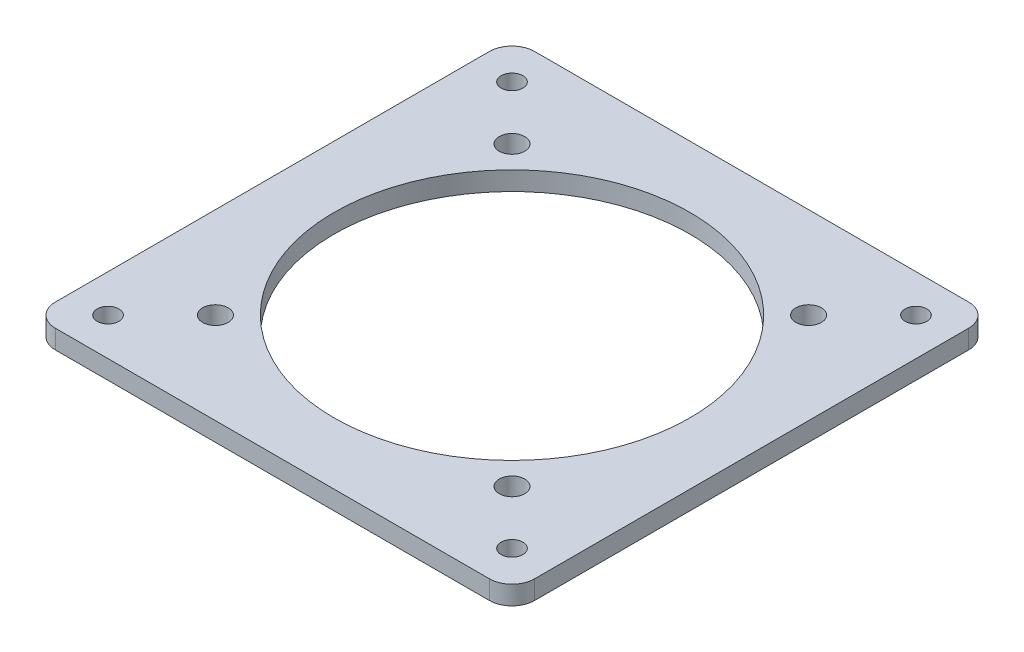
ISO-10303-21;
HEADER;
FILE_DESCRIPTION(('STEP AP214'),'2;1');
FILE_NAME('part.step','',(''),(''),'','','');
FILE_SCHEMA(('AUTOMOTIVE_DESIGN { 1 0 10303 214 1 1 1 1 }'));
ENDSEC;
DATA;
#1=APPLICATION_CONTEXT('core data for automotive mechanical design processes');
#2=APPLICATION_PROTOCOL_DEFINITION('international standard','automotive_design',2000,#1);
#3=PRODUCT_CONTEXT('',#1,'mechanical');
#4=PRODUCT('Part','Part','',(#3));
#5=PRODUCT_RELATED_PRODUCT_CATEGORY('part','',(#4));
#6=PRODUCT_DEFINITION_FORMATION('','',#4);
#7=PRODUCT_DEFINITION_CONTEXT('part definition',#1,'design');
#8=PRODUCT_DEFINITION('design','',#6,#7);
#9=PRODUCT_DEFINITION_SHAPE('','',#8);
#10=(LENGTH_UNIT() NAMED_UNIT(*) SI_UNIT(.MILLI.,.METRE.));
#11=(NAMED_UNIT(*) PLANE_ANGLE_UNIT() SI_UNIT($,.RADIAN.));
#12=(NAMED_UNIT(*) SI_UNIT($,.STERADIAN.) SOLID_ANGLE_UNIT());
#13=UNCERTAINTY_MEASURE_WITH_UNIT(LENGTH_MEASURE(1.E-05),#10,'distance_accuracy_value','');
#14=(GEOMETRIC_REPRESENTATION_CONTEXT(3) GLOBAL_UNCERTAINTY_ASSIGNED_CONTEXT((#13)) GLOBAL_UNIT_ASSIGNED_CONTEXT((#10,
#11,#12)) REPRESENTATION_CONTEXT('',''));
#15=CARTESIAN_POINT('',(0.,0.,0.));
#16=DIRECTION('',(0.,0.,1.));
#17=DIRECTION('',(1.,0.,0.));
#18=AXIS2_PLACEMENT_3D('',#15,#16,#17);
#19=CARTESIAN_POINT('',(36.59,3.175,36.5900000000002));
#20=DIRECTION('',(0.,1.,0.));
#21=DIRECTION('',(0.,0.,1.));
#22=AXIS2_PLACEMENT_3D('',#19,#20,#21);
#23=PLANE('',#22);
#24=CARTESIAN_POINT('',(-34.0499999999999,3.175,34.0499999999995));
#25=DIRECTION('',(0.,1.,0.));
#26=DIRECTION('',(0.,0.,1.));
#27=AXIS2_PLACEMENT_3D('',#24,#25,#26);
#28=CIRCLE('',#27,1.8288);
#29=CARTESIAN_POINT('',(-34.0499999999999,3.175,35.8787999999995));
#30=VERTEX_POINT('',#29);
#31=EDGE_CURVE('E220',#30,#30,#28,.T.);
#32=ORIENTED_EDGE('',*,*,#31,.F.);
#33=EDGE_LOOP('',(#32));
#34=FACE_BOUND('',#33,.T.);
#35=CARTESIAN_POINT('',(34.0500000000001,3.175,-34.0499999999997));
#36=DIRECTION('',(0.,1.,0.));
#37=DIRECTION('',(0.,0.,1.));
#38=AXIS2_PLACEMENT_3D('',#35,#36,#37);
#39=CIRCLE('',#38,1.82880000000001);
#40=CARTESIAN_POINT('',(34.0500000000001,3.175,-32.2211999999997));
#41=VERTEX_POINT('',#40);
#42=EDGE_CURVE('E208',#41,#41,#39,.T.);
#43=ORIENTED_EDGE('',*,*,#42,.F.);
#44=EDGE_LOOP('',(#43));
#45=FACE_BOUND('',#44,.T.);
#46=CARTESIAN_POINT('',(25.,3.175,25.0000000000009));
#47=DIRECTION('',(0.,1.,0.));
#48=DIRECTION('',(0.,0.,1.));
#49=AXIS2_PLACEMENT_3D('',#46,#47,#48);
#50=CIRCLE('',#49,2.15000000000019);
#51=CARTESIAN_POINT('',(25.,3.175,27.1500000000011));
#52=VERTEX_POINT('',#51);
#53=EDGE_CURVE('E196',#52,#52,#50,.T.);
#54=ORIENTED_EDGE('',*,*,#53,.F.);
#55=EDGE_LOOP('',(#54));
#56=FACE_BOUND('',#55,.T.);
#57=CARTESIAN_POINT('',(-25.,3.175,-25.000000000001));
#58=DIRECTION('',(0.,1.,0.));
#59=DIRECTION('',(0.,0.,1.));
#60=AXIS2_PLACEMENT_3D('',#57,#58,#59);
#61=CIRCLE('',#60,2.14999999999967);
#62=CARTESIAN_POINT('',(-25.,3.175,-22.8500000000013));
#63=VERTEX_POINT('',#62);
#64=EDGE_CURVE('E184',#63,#63,#61,.T.);
#65=ORIENTED_EDGE('',*,*,#64,.F.);
#66=EDGE_LOOP('',(#65));
#67=FACE_BOUND('',#66,.T.);
#68=CARTESIAN_POINT('',(36.59,3.175,36.5900000000002));
#69=DIRECTION('',(0.,1.,0.));
#70=DIRECTION('',(0.,0.,1.));
#71=AXIS2_PLACEMENT_3D('',#68,#69,#70);
#72=CIRCLE('',#71,3.80999999999992);
#73=CARTESIAN_POINT('',(36.59,3.175,40.4000000000001));
#74=VERTEX_POINT('',#73);
#75=CARTESIAN_POINT('',(40.4,3.175,36.5900000000002));
#76=VERTEX_POINT('',#75);
#77=EDGE_CURVE('E147',#74,#76,#72,.T.);
#78=ORIENTED_EDGE('',*,*,#77,.T.);
#79=DIRECTION('',(0.,0.,-1.));
#80=VECTOR('',#79,1.);
#81=CARTESIAN_POINT('',(40.4,3.175,-36.5900000000001));
#82=LINE('',#81,#80);
#83=CARTESIAN_POINT('',(40.4,3.175,-36.5900000000001));
#84=VERTEX_POINT('',#83);
#85=EDGE_CURVE('E95',#76,#84,#82,.T.);
#86=ORIENTED_EDGE('',*,*,#85,.T.);
#87=CARTESIAN_POINT('',(36.5900000000001,3.175,-36.5900000000001));
#88=DIRECTION('',(0.,1.,0.));
#89=DIRECTION('',(0.,0.,1.));
#90=AXIS2_PLACEMENT_3D('',#87,#88,#89);
#91=CIRCLE('',#90,3.80999999999993);
#92=CARTESIAN_POINT('',(36.5900000000001,3.175,-40.4));
#93=VERTEX_POINT('',#92);
#94=EDGE_CURVE('E162',#84,#93,#91,.T.);
#95=ORIENTED_EDGE('',*,*,#94,.T.);
#96=DIRECTION('',(-1.,0.,0.));
#97=VECTOR('',#96,1.);
#98=CARTESIAN_POINT('',(-36.5900000000002,3.175,-40.4));
#99=LINE('',#98,#97);
#100=CARTESIAN_POINT('',(-36.5900000000002,3.175,-40.4));
#101=VERTEX_POINT('',#100);
#102=EDGE_CURVE('E175',#93,#101,#99,.T.);
#103=ORIENTED_EDGE('',*,*,#102,.T.);
#104=CARTESIAN_POINT('',(-36.5900000000002,3.175,-36.5900000000001));
#105=DIRECTION('',(0.,1.,0.));
#106=DIRECTION('',(0.,0.,-1.));
#107=AXIS2_PLACEMENT_3D('',#104,#105,#106);
#108=CIRCLE('',#107,3.8099999999999);
#109=CARTESIAN_POINT('',(-40.4,3.175,-36.5900000000001));
#110=VERTEX_POINT('',#109);
#111=EDGE_CURVE('E114',#101,#110,#108,.T.);
#112=ORIENTED_EDGE('',*,*,#111,.T.);
#113=DIRECTION('',(0.,0.,1.));
#114=VECTOR('',#113,1.);
#115=CARTESIAN_POINT('',(-40.4,3.175,-36.5900000000001));
#116=LINE('',#115,#114);
#117=CARTESIAN_POINT('',(-40.4,3.175,36.5900000000001));
#118=VERTEX_POINT('',#117);
#119=EDGE_CURVE('E108',#110,#118,#116,.T.);
#120=ORIENTED_EDGE('',*,*,#119,.T.);
#121=CARTESIAN_POINT('',(-36.59,3.175,36.5900000000001));
#122=DIRECTION('',(0.,1.,0.));
#123=DIRECTION('',(0.,0.,-1.));
#124=AXIS2_PLACEMENT_3D('',#121,#122,#123);
#125=CIRCLE('',#124,3.81000000000004);
#126=CARTESIAN_POINT('',(-36.59,3.175,40.4000000000001));
#127=VERTEX_POINT('',#126);
#128=EDGE_CURVE('E112',#118,#127,#125,.T.);
#129=ORIENTED_EDGE('',*,*,#128,.T.);
#130=DIRECTION('',(1.,0.,0.));
#131=VECTOR('',#130,1.);
#132=CARTESIAN_POINT('',(-36.59,3.175,40.4000000000001));
#133=LINE('',#132,#131);
#134=EDGE_CURVE('E52',#127,#74,#133,.T.);
#135=ORIENTED_EDGE('',*,*,#134,.T.);
#136=EDGE_LOOP('',(#78,#86,#95,#103,#112,#120,#129,#135));
#137=FACE_BOUND('',#136,.T.);
#138=CARTESIAN_POINT('',(0.,3.175,0.));
#139=DIRECTION('',(0.,1.,0.));
#140=DIRECTION('',(0.,0.,1.));
#141=AXIS2_PLACEMENT_3D('',#138,#139,#140);
#142=CIRCLE('',#141,30.);
#143=CARTESIAN_POINT('',(0.,3.175,30.));
#144=VERTEX_POINT('',#143);
#145=EDGE_CURVE('E136',#144,#144,#142,.T.);
#146=ORIENTED_EDGE('',*,*,#145,.F.);
#147=EDGE_LOOP('',(#146));
#148=FACE_BOUND('',#147,.T.);
#149=CARTESIAN_POINT('',(25.,3.175,-25.0000000000009));
#150=DIRECTION('',(0.,1.,0.));
#151=DIRECTION('',(0.,0.,1.));
#152=AXIS2_PLACEMENT_3D('',#149,#150,#151);
#153=CIRCLE('',#152,2.14999999999969);
#154=CARTESIAN_POINT('',(25.,3.175,-22.8500000000012));
#155=VERTEX_POINT('',#154);
#156=EDGE_CURVE('E190',#155,#155,#153,.T.);
#157=ORIENTED_EDGE('',*,*,#156,.F.);
#158=EDGE_LOOP('',(#157));
#159=FACE_BOUND('',#158,.T.);
#160=CARTESIAN_POINT('',(-25.,3.175,25.0000000000009));
#161=DIRECTION('',(0.,1.,0.));
#162=DIRECTION('',(0.,0.,1.));
#163=AXIS2_PLACEMENT_3D('',#160,#161,#162);
#164=CIRCLE('',#163,2.15000000000013);
#165=CARTESIAN_POINT('',(-25.,3.175,27.150000000001));
#166=VERTEX_POINT('',#165);
#167=EDGE_CURVE('E202',#166,#166,#164,.T.);
#168=ORIENTED_EDGE('',*,*,#167,.F.);
#169=EDGE_LOOP('',(#168));
#170=FACE_BOUND('',#169,.T.);
#171=CARTESIAN_POINT('',(34.0500000000001,3.175,34.0499999999995));
#172=DIRECTION('',(0.,1.,0.));
#173=DIRECTION('',(0.,0.,1.));
#174=AXIS2_PLACEMENT_3D('',#171,#172,#173);
#175=CIRCLE('',#174,1.82880000000001);
#176=CARTESIAN_POINT('',(34.0500000000001,3.175,35.8787999999995));
#177=VERTEX_POINT('',#176);
#178=EDGE_CURVE('E214',#177,#177,#175,.T.);
#179=ORIENTED_EDGE('',*,*,#178,.F.);
#180=EDGE_LOOP('',(#179));
#181=FACE_BOUND('',#180,.T.);
#182=CARTESIAN_POINT('',(-34.0499999999999,3.175,-34.0499999999997));
#183=DIRECTION('',(0.,1.,0.));
#184=DIRECTION('',(0.,0.,1.));
#185=AXIS2_PLACEMENT_3D('',#182,#183,#184);
#186=CIRCLE('',#185,1.8288);
#187=CARTESIAN_POINT('',(-34.0499999999999,3.175,-32.2211999999997));
#188=VERTEX_POINT('',#187);
#189=EDGE_CURVE('E226',#188,#188,#186,.T.);
#190=ORIENTED_EDGE('',*,*,#189,.F.);
#191=EDGE_LOOP('',(#190));
#192=FACE_BOUND('',#191,.T.);
#193=ADVANCED_FACE('F35',(#34,#45,#56,#67,#137,#148,#159,#170,#181,#192),#23,.T.);
#194=CARTESIAN_POINT('',(36.59,0.,36.5900000000002));
#195=DIRECTION('',(0.,1.,0.));
#196=DIRECTION('',(0.,0.,1.));
#197=AXIS2_PLACEMENT_3D('',#194,#195,#196);
#198=PLANE('',#197);
#199=CARTESIAN_POINT('',(36.59,0.,36.5900000000002));
#200=DIRECTION('',(0.,1.,0.));
#201=DIRECTION('',(0.,0.,1.));
#202=AXIS2_PLACEMENT_3D('',#199,#200,#201);
#203=CIRCLE('',#202,3.80999999999992);
#204=CARTESIAN_POINT('',(36.59,0.,40.4000000000001));
#205=VERTEX_POINT('',#204);
#206=CARTESIAN_POINT('',(40.4,0.,36.5900000000002));
#207=VERTEX_POINT('',#206);
#208=EDGE_CURVE('E132',#205,#207,#203,.T.);
#209=ORIENTED_EDGE('',*,*,#208,.F.);
#210=DIRECTION('',(1.,0.,0.));
#211=VECTOR('',#210,1.);
#212=CARTESIAN_POINT('',(-36.59,0.,40.4000000000001));
#213=LINE('',#212,#211);
#214=CARTESIAN_POINT('',(-36.59,0.,40.4000000000001));
#215=VERTEX_POINT('',#214);
#216=EDGE_CURVE('E87',#215,#205,#213,.T.);
#217=ORIENTED_EDGE('',*,*,#216,.F.);
#218=CARTESIAN_POINT('',(-36.59,0.,36.5900000000001));
#219=DIRECTION('',(0.,1.,0.));
#220=DIRECTION('',(0.,0.,-1.));
#221=AXIS2_PLACEMENT_3D('',#218,#219,#220);
#222=CIRCLE('',#221,3.81000000000004);
#223=CARTESIAN_POINT('',(-40.4,0.,36.5900000000001));
#224=VERTEX_POINT('',#223);
#225=EDGE_CURVE('E81',#224,#215,#222,.T.);
#226=ORIENTED_EDGE('',*,*,#225,.F.);
#227=DIRECTION('',(0.,0.,1.));
#228=VECTOR('',#227,1.);
#229=CARTESIAN_POINT('',(-40.4,0.,-36.5900000000001));
#230=LINE('',#229,#228);
#231=CARTESIAN_POINT('',(-40.4,0.,-36.5900000000001));
#232=VERTEX_POINT('',#231);
#233=EDGE_CURVE('E122',#232,#224,#230,.T.);
#234=ORIENTED_EDGE('',*,*,#233,.F.);
#235=CARTESIAN_POINT('',(-36.5900000000002,0.,-36.5900000000001));
#236=DIRECTION('',(0.,1.,0.));
#237=DIRECTION('',(0.,0.,-1.));
#238=AXIS2_PLACEMENT_3D('',#235,#236,#237);
#239=CIRCLE('',#238,3.8099999999999);
#240=CARTESIAN_POINT('',(-36.5900000000002,0.,-40.4));
#241=VERTEX_POINT('',#240);
#242=EDGE_CURVE('E142',#241,#232,#239,.T.);
#243=ORIENTED_EDGE('',*,*,#242,.F.);
#244=DIRECTION('',(-1.,0.,0.));
#245=VECTOR('',#244,1.);
#246=CARTESIAN_POINT('',(-36.5900000000002,0.,-40.4));
#247=LINE('',#246,#245);
#248=CARTESIAN_POINT('',(36.5900000000001,0.,-40.4));
#249=VERTEX_POINT('',#248);
#250=EDGE_CURVE('E140',#249,#241,#247,.T.);
#251=ORIENTED_EDGE('',*,*,#250,.F.);
#252=CARTESIAN_POINT('',(36.5900000000001,0.,-36.5900000000001));
#253=DIRECTION('',(0.,1.,0.));
#254=DIRECTION('',(0.,0.,1.));
#255=AXIS2_PLACEMENT_3D('',#252,#253,#254);
#256=CIRCLE('',#255,3.80999999999993);
#257=CARTESIAN_POINT('',(40.4,0.,-36.5900000000001));
#258=VERTEX_POINT('',#257);
#259=EDGE_CURVE('E138',#258,#249,#256,.T.);
#260=ORIENTED_EDGE('',*,*,#259,.F.);
#261=DIRECTION('',(0.,0.,-1.));
#262=VECTOR('',#261,1.);
#263=CARTESIAN_POINT('',(40.4,0.,-36.5900000000001));
#264=LINE('',#263,#262);
#265=EDGE_CURVE('E135',#207,#258,#264,.T.);
#266=ORIENTED_EDGE('',*,*,#265,.F.);
#267=EDGE_LOOP('',(#209,#217,#226,#234,#243,#251,#260,#266));
#268=FACE_BOUND('',#267,.T.);
#269=CARTESIAN_POINT('',(0.,0.,0.));
#270=DIRECTION('',(0.,1.,0.));
#271=DIRECTION('',(0.,0.,1.));
#272=AXIS2_PLACEMENT_3D('',#269,#270,#271);
#273=CIRCLE('',#272,30.);
#274=CARTESIAN_POINT('',(0.,0.,30.));
#275=VERTEX_POINT('',#274);
#276=EDGE_CURVE('E181',#275,#275,#273,.T.);
#277=ORIENTED_EDGE('',*,*,#276,.T.);
#278=EDGE_LOOP('',(#277));
#279=FACE_BOUND('',#278,.T.);
#280=CARTESIAN_POINT('',(-25.,0.,-25.000000000001));
#281=DIRECTION('',(0.,1.,0.));
#282=DIRECTION('',(0.,0.,1.));
#283=AXIS2_PLACEMENT_3D('',#280,#281,#282);
#284=CIRCLE('',#283,2.14999999999967);
#285=CARTESIAN_POINT('',(-25.,0.,-22.8500000000013));
#286=VERTEX_POINT('',#285);
#287=EDGE_CURVE('E187',#286,#286,#284,.T.);
#288=ORIENTED_EDGE('',*,*,#287,.T.);
#289=EDGE_LOOP('',(#288));
#290=FACE_BOUND('',#289,.T.);
#291=CARTESIAN_POINT('',(25.,0.,-25.0000000000009));
#292=DIRECTION('',(0.,1.,0.));
#293=DIRECTION('',(0.,0.,1.));
#294=AXIS2_PLACEMENT_3D('',#291,#292,#293);
#295=CIRCLE('',#294,2.14999999999969);
#296=CARTESIAN_POINT('',(25.,0.,-22.8500000000012));
#297=VERTEX_POINT('',#296);
#298=EDGE_CURVE('E193',#297,#297,#295,.T.);
#299=ORIENTED_EDGE('',*,*,#298,.T.);
#300=EDGE_LOOP('',(#299));
#301=FACE_BOUND('',#300,.T.);
#302=CARTESIAN_POINT('',(25.,0.,25.0000000000009));
#303=DIRECTION('',(0.,1.,0.));
#304=DIRECTION('',(0.,0.,1.));
#305=AXIS2_PLACEMENT_3D('',#302,#303,#304);
#306=CIRCLE('',#305,2.15000000000019);
#307=CARTESIAN_POINT('',(25.,0.,27.1500000000011));
#308=VERTEX_POINT('',#307);
#309=EDGE_CURVE('E199',#308,#308,#306,.T.);
#310=ORIENTED_EDGE('',*,*,#309,.T.);
#311=EDGE_LOOP('',(#310));
#312=FACE_BOUND('',#311,.T.);
#313=CARTESIAN_POINT('',(-25.,0.,25.0000000000009));
#314=DIRECTION('',(0.,1.,0.));
#315=DIRECTION('',(0.,0.,1.));
#316=AXIS2_PLACEMENT_3D('',#313,#314,#315);
#317=CIRCLE('',#316,2.15000000000013);
#318=CARTESIAN_POINT('',(-25.,0.,27.150000000001));
#319=VERTEX_POINT('',#318);
#320=EDGE_CURVE('E205',#319,#319,#317,.T.);
#321=ORIENTED_EDGE('',*,*,#320,.T.);
#322=EDGE_LOOP('',(#321));
#323=FACE_BOUND('',#322,.T.);
#324=CARTESIAN_POINT('',(34.0500000000001,0.,-34.0499999999997));
#325=DIRECTION('',(0.,1.,0.));
#326=DIRECTION('',(0.,0.,1.));
#327=AXIS2_PLACEMENT_3D('',#324,#325,#326);
#328=CIRCLE('',#327,1.82880000000001);
#329=CARTESIAN_POINT('',(34.0500000000001,0.,-32.2211999999997));
#330=VERTEX_POINT('',#329);
#331=EDGE_CURVE('E211',#330,#330,#328,.T.);
#332=ORIENTED_EDGE('',*,*,#331,.T.);
#333=EDGE_LOOP('',(#332));
#334=FACE_BOUND('',#333,.T.);
#335=CARTESIAN_POINT('',(34.0500000000001,0.,34.0499999999995));
#336=DIRECTION('',(0.,1.,0.));
#337=DIRECTION('',(0.,0.,1.));
#338=AXIS2_PLACEMENT_3D('',#335,#336,#337);
#339=CIRCLE('',#338,1.82880000000001);
#340=CARTESIAN_POINT('',(34.0500000000001,0.,35.8787999999995));
#341=VERTEX_POINT('',#340);
#342=EDGE_CURVE('E217',#341,#341,#339,.T.);
#343=ORIENTED_EDGE('',*,*,#342,.T.);
#344=EDGE_LOOP('',(#343));
#345=FACE_BOUND('',#344,.T.);
#346=CARTESIAN_POINT('',(-34.0499999999999,0.,34.0499999999995));
#347=DIRECTION('',(0.,1.,0.));
#348=DIRECTION('',(0.,0.,1.));
#349=AXIS2_PLACEMENT_3D('',#346,#347,#348);
#350=CIRCLE('',#349,1.8288);
#351=CARTESIAN_POINT('',(-34.0499999999999,0.,35.8787999999995));
#352=VERTEX_POINT('',#351);
#353=EDGE_CURVE('E223',#352,#352,#350,.T.);
#354=ORIENTED_EDGE('',*,*,#353,.T.);
#355=EDGE_LOOP('',(#354));
#356=FACE_BOUND('',#355,.T.);
#357=CARTESIAN_POINT('',(-34.0499999999999,0.,-34.0499999999997));
#358=DIRECTION('',(0.,1.,0.));
#359=DIRECTION('',(0.,0.,1.));
#360=AXIS2_PLACEMENT_3D('',#357,#358,#359);
#361=CIRCLE('',#360,1.8288);
#362=CARTESIAN_POINT('',(-34.0499999999999,0.,-32.2211999999997));
#363=VERTEX_POINT('',#362);
#364=EDGE_CURVE('E229',#363,#363,#361,.T.);
#365=ORIENTED_EDGE('',*,*,#364,.T.);
#366=EDGE_LOOP('',(#365));
#367=FACE_BOUND('',#366,.T.);
#368=ADVANCED_FACE('F166',(#268,#279,#290,#301,#312,#323,#334,#345,#356,#367),#198,.F.);
#369=CARTESIAN_POINT('',(36.59,3.175,36.5900000000002));
#370=DIRECTION('',(0.,-1.,0.));
#371=DIRECTION('',(0.,0.,-1.));
#372=AXIS2_PLACEMENT_3D('',#369,#370,#371);
#373=CYLINDRICAL_SURFACE('',#372,3.80999999999992);
#374=ORIENTED_EDGE('',*,*,#208,.T.);
#375=DIRECTION('',(0.,-1.,0.));
#376=VECTOR('',#375,1.);
#377=CARTESIAN_POINT('',(40.4,3.175,36.5900000000002));
#378=LINE('',#377,#376);
#379=EDGE_CURVE('E11',#76,#207,#378,.T.);
#380=ORIENTED_EDGE('',*,*,#379,.F.);
#381=ORIENTED_EDGE('',*,*,#77,.F.);
#382=DIRECTION('',(0.,-1.,0.));
#383=VECTOR('',#382,1.);
#384=CARTESIAN_POINT('',(36.59,3.175,40.4000000000001));
#385=LINE('',#384,#383);
#386=EDGE_CURVE('E128',#74,#205,#385,.T.);
#387=ORIENTED_EDGE('',*,*,#386,.T.);
#388=EDGE_LOOP('',(#374,#380,#381,#387));
#389=FACE_BOUND('',#388,.T.);
#390=ADVANCED_FACE('F37',(#389),#373,.T.);
#391=CARTESIAN_POINT('',(40.4,3.175,-36.5900000000001));
#392=DIRECTION('',(-1.,0.,0.));
#393=DIRECTION('',(0.,0.,1.));
#394=AXIS2_PLACEMENT_3D('',#391,#392,#393);
#395=PLANE('',#394);
#396=ORIENTED_EDGE('',*,*,#265,.T.);
#397=DIRECTION('',(0.,-1.,0.));
#398=VECTOR('',#397,1.);
#399=CARTESIAN_POINT('',(40.4,3.175,-36.5900000000001));
#400=LINE('',#399,#398);
#401=EDGE_CURVE('E44',#84,#258,#400,.T.);
#402=ORIENTED_EDGE('',*,*,#401,.F.);
#403=ORIENTED_EDGE('',*,*,#85,.F.);
#404=ORIENTED_EDGE('',*,*,#379,.T.);
#405=EDGE_LOOP('',(#396,#402,#403,#404));
#406=FACE_BOUND('',#405,.T.);
#407=ADVANCED_FACE('F263',(#406),#395,.F.);
#408=CARTESIAN_POINT('',(36.5900000000001,3.175,-36.5900000000001));
#409=DIRECTION('',(0.,-1.,0.));
#410=DIRECTION('',(0.,0.,-1.));
#411=AXIS2_PLACEMENT_3D('',#408,#409,#410);
#412=CYLINDRICAL_SURFACE('',#411,3.80999999999993);
#413=ORIENTED_EDGE('',*,*,#259,.T.);
#414=DIRECTION('',(0.,-1.,0.));
#415=VECTOR('',#414,1.);
#416=CARTESIAN_POINT('',(36.5900000000001,3.175,-40.4));
#417=LINE('',#416,#415);
#418=EDGE_CURVE('E154',#93,#249,#417,.T.);
#419=ORIENTED_EDGE('',*,*,#418,.F.);
#420=ORIENTED_EDGE('',*,*,#94,.F.);
#421=ORIENTED_EDGE('',*,*,#401,.T.);
#422=EDGE_LOOP('',(#413,#419,#420,#421));
#423=FACE_BOUND('',#422,.T.);
#424=ADVANCED_FACE('F160',(#423),#412,.T.);
#425=CARTESIAN_POINT('',(-36.5900000000002,3.175,-40.4));
#426=DIRECTION('',(0.,0.,1.));
#427=DIRECTION('',(1.,0.,0.));
#428=AXIS2_PLACEMENT_3D('',#425,#426,#427);
#429=PLANE('',#428);
#430=ORIENTED_EDGE('',*,*,#250,.T.);
#431=DIRECTION('',(0.,-1.,0.));
#432=VECTOR('',#431,1.);
#433=CARTESIAN_POINT('',(-36.5900000000002,3.175,-40.4));
#434=LINE('',#433,#432);
#435=EDGE_CURVE('E151',#101,#241,#434,.T.);
#436=ORIENTED_EDGE('',*,*,#435,.F.);
#437=ORIENTED_EDGE('',*,*,#102,.F.);
#438=ORIENTED_EDGE('',*,*,#418,.T.);
#439=EDGE_LOOP('',(#430,#436,#437,#438));
#440=FACE_BOUND('',#439,.T.);
#441=ADVANCED_FACE('F171',(#440),#429,.F.);
#442=CARTESIAN_POINT('',(-36.5900000000002,3.175,-36.5900000000001));
#443=DIRECTION('',(0.,-1.,0.));
#444=DIRECTION('',(0.,0.,-1.));
#445=AXIS2_PLACEMENT_3D('',#442,#443,#444);
#446=CYLINDRICAL_SURFACE('',#445,3.8099999999999);
#447=ORIENTED_EDGE('',*,*,#242,.T.);
#448=DIRECTION('',(0.,-1.,0.));
#449=VECTOR('',#448,1.);
#450=CARTESIAN_POINT('',(-40.4,3.175,-36.5900000000001));
#451=LINE('',#450,#449);
#452=EDGE_CURVE('E123',#110,#232,#451,.T.);
#453=ORIENTED_EDGE('',*,*,#452,.F.);
#454=ORIENTED_EDGE('',*,*,#111,.F.);
#455=ORIENTED_EDGE('',*,*,#435,.T.);
#456=EDGE_LOOP('',(#447,#453,#454,#455));
#457=FACE_BOUND('',#456,.T.);
#458=ADVANCED_FACE('F174',(#457),#446,.T.);
#459=CARTESIAN_POINT('',(-40.4,3.175,-36.5900000000001));
#460=DIRECTION('',(1.,0.,0.));
#461=DIRECTION('',(0.,0.,-1.));
#462=AXIS2_PLACEMENT_3D('',#459,#460,#461);
#463=PLANE('',#462);
#464=ORIENTED_EDGE('',*,*,#233,.T.);
#465=DIRECTION('',(0.,-1.,0.));
#466=VECTOR('',#465,1.);
#467=CARTESIAN_POINT('',(-40.4,3.175,36.5900000000001));
#468=LINE('',#467,#466);
#469=EDGE_CURVE('E119',#118,#224,#468,.T.);
#470=ORIENTED_EDGE('',*,*,#469,.F.);
#471=ORIENTED_EDGE('',*,*,#119,.F.);
#472=ORIENTED_EDGE('',*,*,#452,.T.);
#473=EDGE_LOOP('',(#464,#470,#471,#472));
#474=FACE_BOUND('',#473,.T.);
#475=ADVANCED_FACE('F120',(#474),#463,.F.);
#476=CARTESIAN_POINT('',(-36.59,3.175,36.5900000000001));
#477=DIRECTION('',(0.,-1.,0.));
#478=DIRECTION('',(0.,0.,-1.));
#479=AXIS2_PLACEMENT_3D('',#476,#477,#478);
#480=CYLINDRICAL_SURFACE('',#479,3.81000000000004);
#481=ORIENTED_EDGE('',*,*,#225,.T.);
#482=DIRECTION('',(0.,-1.,0.));
#483=VECTOR('',#482,1.);
#484=CARTESIAN_POINT('',(-36.59,3.175,40.4000000000001));
#485=LINE('',#484,#483);
#486=EDGE_CURVE('E124',#127,#215,#485,.T.);
#487=ORIENTED_EDGE('',*,*,#486,.F.);
#488=ORIENTED_EDGE('',*,*,#128,.F.);
#489=ORIENTED_EDGE('',*,*,#469,.T.);
#490=EDGE_LOOP('',(#481,#487,#488,#489));
#491=FACE_BOUND('',#490,.T.);
#492=ADVANCED_FACE('F126',(#491),#480,.T.);
#493=CARTESIAN_POINT('',(-36.59,3.175,40.4000000000001));
#494=DIRECTION('',(0.,0.,-1.));
#495=DIRECTION('',(-1.,0.,0.));
#496=AXIS2_PLACEMENT_3D('',#493,#494,#495);
#497=PLANE('',#496);
#498=ORIENTED_EDGE('',*,*,#216,.T.);
#499=ORIENTED_EDGE('',*,*,#386,.F.);
#500=ORIENTED_EDGE('',*,*,#134,.F.);
#501=ORIENTED_EDGE('',*,*,#486,.T.);
#502=EDGE_LOOP('',(#498,#499,#500,#501));
#503=FACE_BOUND('',#502,.T.);
#504=ADVANCED_FACE('F251',(#503),#497,.F.);
#505=CARTESIAN_POINT('',(0.,3.175,0.));
#506=DIRECTION('',(0.,-1.,0.));
#507=DIRECTION('',(0.,0.,-1.));
#508=AXIS2_PLACEMENT_3D('',#505,#506,#507);
#509=CYLINDRICAL_SURFACE('',#508,30.);
#510=ORIENTED_EDGE('',*,*,#145,.T.);
#511=EDGE_LOOP('',(#510));
#512=FACE_BOUND('',#511,.T.);
#513=ORIENTED_EDGE('',*,*,#276,.F.);
#514=EDGE_LOOP('',(#513));
#515=FACE_BOUND('',#514,.T.);
#516=ADVANCED_FACE('F248',(#512,#515),#509,.F.);
#517=CARTESIAN_POINT('',(-25.,3.175,-25.000000000001));
#518=DIRECTION('',(0.,-1.,0.));
#519=DIRECTION('',(0.,0.,-1.));
#520=AXIS2_PLACEMENT_3D('',#517,#518,#519);
#521=CYLINDRICAL_SURFACE('',#520,2.14999999999967);
#522=ORIENTED_EDGE('',*,*,#64,.T.);
#523=EDGE_LOOP('',(#522));
#524=FACE_BOUND('',#523,.T.);
#525=ORIENTED_EDGE('',*,*,#287,.F.);
#526=EDGE_LOOP('',(#525));
#527=FACE_BOUND('',#526,.T.);
#528=ADVANCED_FACE('F327',(#524,#527),#521,.F.);
#529=CARTESIAN_POINT('',(25.,3.175,-25.0000000000009));
#530=DIRECTION('',(0.,-1.,0.));
#531=DIRECTION('',(0.,0.,-1.));
#532=AXIS2_PLACEMENT_3D('',#529,#530,#531);
#533=CYLINDRICAL_SURFACE('',#532,2.14999999999969);
#534=ORIENTED_EDGE('',*,*,#156,.T.);
#535=EDGE_LOOP('',(#534));
#536=FACE_BOUND('',#535,.T.);
#537=ORIENTED_EDGE('',*,*,#298,.F.);
#538=EDGE_LOOP('',(#537));
#539=FACE_BOUND('',#538,.T.);
#540=ADVANCED_FACE('F335',(#536,#539),#533,.F.);
#541=CARTESIAN_POINT('',(25.,3.175,25.0000000000009));
#542=DIRECTION('',(0.,-1.,0.));
#543=DIRECTION('',(0.,0.,-1.));
#544=AXIS2_PLACEMENT_3D('',#541,#542,#543);
#545=CYLINDRICAL_SURFACE('',#544,2.15000000000019);
#546=ORIENTED_EDGE('',*,*,#53,.T.);
#547=EDGE_LOOP('',(#546));
#548=FACE_BOUND('',#547,.T.);
#549=ORIENTED_EDGE('',*,*,#309,.F.);
#550=EDGE_LOOP('',(#549));
#551=FACE_BOUND('',#550,.T.);
#552=ADVANCED_FACE('F343',(#548,#551),#545,.F.);
#553=CARTESIAN_POINT('',(-25.,3.175,25.0000000000009));
#554=DIRECTION('',(0.,-1.,0.));
#555=DIRECTION('',(0.,0.,-1.));
#556=AXIS2_PLACEMENT_3D('',#553,#554,#555);
#557=CYLINDRICAL_SURFACE('',#556,2.15000000000013);
#558=ORIENTED_EDGE('',*,*,#167,.T.);
#559=EDGE_LOOP('',(#558));
#560=FACE_BOUND('',#559,.T.);
#561=ORIENTED_EDGE('',*,*,#320,.F.);
#562=EDGE_LOOP('',(#561));
#563=FACE_BOUND('',#562,.T.);
#564=ADVANCED_FACE('F352',(#560,#563),#557,.F.);
#565=CARTESIAN_POINT('',(34.0500000000001,3.175,-34.0499999999997));
#566=DIRECTION('',(0.,-1.,0.));
#567=DIRECTION('',(0.,0.,-1.));
#568=AXIS2_PLACEMENT_3D('',#565,#566,#567);
#569=CYLINDRICAL_SURFACE('',#568,1.82880000000001);
#570=ORIENTED_EDGE('',*,*,#42,.T.);
#571=EDGE_LOOP('',(#570));
#572=FACE_BOUND('',#571,.T.);
#573=ORIENTED_EDGE('',*,*,#331,.F.);
#574=EDGE_LOOP('',(#573));
#575=FACE_BOUND('',#574,.T.);
#576=ADVANCED_FACE('F361',(#572,#575),#569,.F.);
#577=CARTESIAN_POINT('',(34.0500000000001,3.175,34.0499999999995));
#578=DIRECTION('',(0.,-1.,0.));
#579=DIRECTION('',(0.,0.,-1.));
#580=AXIS2_PLACEMENT_3D('',#577,#578,#579);
#581=CYLINDRICAL_SURFACE('',#580,1.82880000000001);
#582=ORIENTED_EDGE('',*,*,#178,.T.);
#583=EDGE_LOOP('',(#582));
#584=FACE_BOUND('',#583,.T.);
#585=ORIENTED_EDGE('',*,*,#342,.F.);
#586=EDGE_LOOP('',(#585));
#587=FACE_BOUND('',#586,.T.);
#588=ADVANCED_FACE('F370',(#584,#587),#581,.F.);
#589=CARTESIAN_POINT('',(-34.0499999999999,3.175,34.0499999999995));
#590=DIRECTION('',(0.,-1.,0.));
#591=DIRECTION('',(0.,0.,-1.));
#592=AXIS2_PLACEMENT_3D('',#589,#590,#591);
#593=CYLINDRICAL_SURFACE('',#592,1.8288);
#594=ORIENTED_EDGE('',*,*,#31,.T.);
#595=EDGE_LOOP('',(#594));
#596=FACE_BOUND('',#595,.T.);
#597=ORIENTED_EDGE('',*,*,#353,.F.);
#598=EDGE_LOOP('',(#597));
#599=FACE_BOUND('',#598,.T.);
#600=ADVANCED_FACE('F379',(#596,#599),#593,.F.);
#601=CARTESIAN_POINT('',(-34.0499999999999,3.175,-34.0499999999997));
#602=DIRECTION('',(0.,-1.,0.));
#603=DIRECTION('',(0.,0.,-1.));
#604=AXIS2_PLACEMENT_3D('',#601,#602,#603);
#605=CYLINDRICAL_SURFACE('',#604,1.8288);
#606=ORIENTED_EDGE('',*,*,#189,.T.);
#607=EDGE_LOOP('',(#606));
#608=FACE_BOUND('',#607,.T.);
#609=ORIENTED_EDGE('',*,*,#364,.F.);
#610=EDGE_LOOP('',(#609));
#611=FACE_BOUND('',#610,.T.);
#612=ADVANCED_FACE('F235',(#608,#611),#605,.F.);
#613=CLOSED_SHELL('',(#193,#368,#390,#407,#424,#441,#458,#475,#492,#504,#516,#528,#540,#552,
#564,#576,#588,#600,#612));
#614=MANIFOLD_SOLID_BREP('B2',#613);
#615=ADVANCED_BREP_SHAPE_REPRESENTATION('',(#18,#614),#14);
#616=SHAPE_DEFINITION_REPRESENTATION(#9,#615);
ENDSEC;
END-ISO-10303-21;
